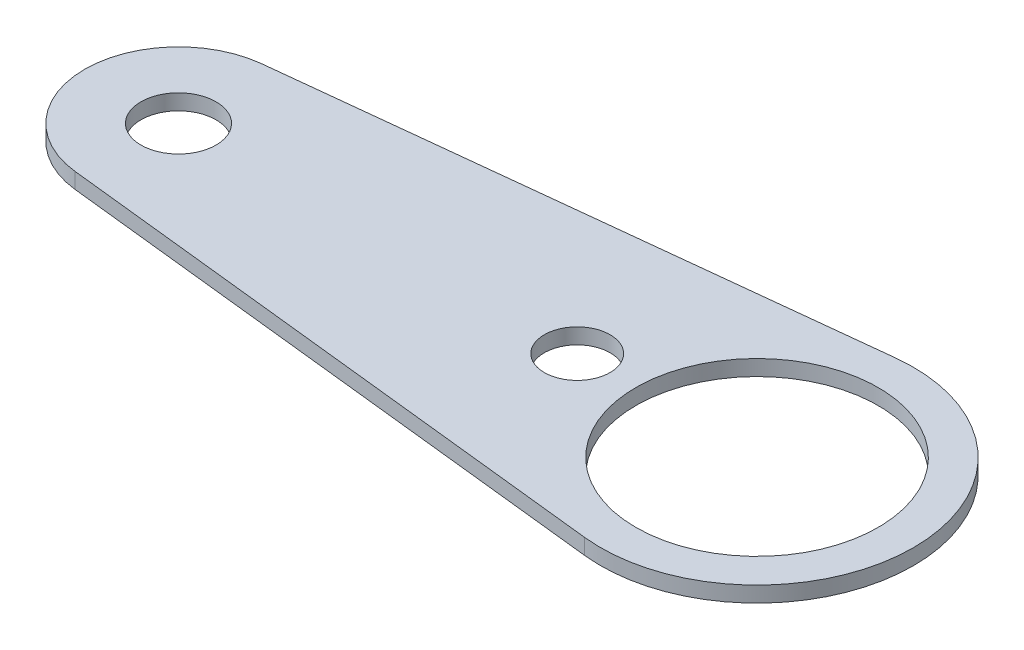
ISO-10303-21;
HEADER;
FILE_DESCRIPTION(('STEP AP214'),'2;1');
FILE_NAME('part.step','',(''),(''),'','','');
FILE_SCHEMA(('AUTOMOTIVE_DESIGN { 1 0 10303 214 1 1 1 1 }'));
ENDSEC;
DATA;
#1=APPLICATION_CONTEXT('core data for automotive mechanical design processes');
#2=APPLICATION_PROTOCOL_DEFINITION('international standard','automotive_design',2000,#1);
#3=PRODUCT_CONTEXT('',#1,'mechanical');
#4=PRODUCT('Part','Part','',(#3));
#5=PRODUCT_RELATED_PRODUCT_CATEGORY('part','',(#4));
#6=PRODUCT_DEFINITION_FORMATION('','',#4);
#7=PRODUCT_DEFINITION_CONTEXT('part definition',#1,'design');
#8=PRODUCT_DEFINITION('design','',#6,#7);
#9=PRODUCT_DEFINITION_SHAPE('','',#8);
#10=(LENGTH_UNIT() NAMED_UNIT(*) SI_UNIT(.MILLI.,.METRE.));
#11=(NAMED_UNIT(*) PLANE_ANGLE_UNIT() SI_UNIT($,.RADIAN.));
#12=(NAMED_UNIT(*) SI_UNIT($,.STERADIAN.) SOLID_ANGLE_UNIT());
#13=UNCERTAINTY_MEASURE_WITH_UNIT(LENGTH_MEASURE(1.E-05),#10,'distance_accuracy_value','');
#14=(GEOMETRIC_REPRESENTATION_CONTEXT(3) GLOBAL_UNCERTAINTY_ASSIGNED_CONTEXT((#13)) GLOBAL_UNIT_ASSIGNED_CONTEXT((#10,
#11,#12)) REPRESENTATION_CONTEXT('',''));
#15=CARTESIAN_POINT('',(0.,0.,0.));
#16=DIRECTION('',(0.,0.,1.));
#17=DIRECTION('',(1.,0.,0.));
#18=AXIS2_PLACEMENT_3D('',#15,#16,#17);
#19=CARTESIAN_POINT('',(0.,1.,0.));
#20=DIRECTION('',(0.,1.,0.));
#21=DIRECTION('',(0.,0.,1.));
#22=AXIS2_PLACEMENT_3D('',#19,#20,#21);
#23=PLANE('',#22);
#24=CARTESIAN_POINT('',(0.,1.,0.));
#25=DIRECTION('',(0.,1.,0.));
#26=DIRECTION('',(0.,0.,1.));
#27=AXIS2_PLACEMENT_3D('',#24,#25,#26);
#28=CIRCLE('',#27,7.75);
#29=CARTESIAN_POINT('',(0.,1.,7.75));
#30=VERTEX_POINT('',#29);
#31=EDGE_CURVE('E115',#30,#30,#28,.T.);
#32=ORIENTED_EDGE('',*,*,#31,.F.);
#33=EDGE_LOOP('',(#32));
#34=FACE_BOUND('',#33,.T.);
#35=CARTESIAN_POINT('',(0.,1.,0.));
#36=DIRECTION('',(0.,1.,0.));
#37=DIRECTION('',(0.,0.,1.));
#38=AXIS2_PLACEMENT_3D('',#35,#36,#37);
#39=CIRCLE('',#38,10.);
#40=CARTESIAN_POINT('',(-1.08108108108108,1.,9.94139143662136));
#41=VERTEX_POINT('',#40);
#42=CARTESIAN_POINT('',(-1.08108108108108,1.,-9.94139143662136));
#43=VERTEX_POINT('',#42);
#44=EDGE_CURVE('E85',#41,#43,#39,.T.);
#45=ORIENTED_EDGE('',*,*,#44,.T.);
#46=DIRECTION('',(-0.994139143662136,0.,0.108108108108108));
#47=VECTOR('',#46,1.);
#48=CARTESIAN_POINT('',(-1.08108108108108,1.,-9.94139143662136));
#49=LINE('',#48,#47);
#50=CARTESIAN_POINT('',(-37.6486486486486,1.,-5.96483486197282));
#51=VERTEX_POINT('',#50);
#52=EDGE_CURVE('E80',#43,#51,#49,.T.);
#53=ORIENTED_EDGE('',*,*,#52,.T.);
#54=CARTESIAN_POINT('',(-37.,1.,0.));
#55=DIRECTION('',(0.,1.,0.));
#56=DIRECTION('',(0.,0.,1.));
#57=AXIS2_PLACEMENT_3D('',#54,#55,#56);
#58=CIRCLE('',#57,6.);
#59=CARTESIAN_POINT('',(-37.6486486486486,1.,5.96483486197282));
#60=VERTEX_POINT('',#59);
#61=EDGE_CURVE('E83',#51,#60,#58,.T.);
#62=ORIENTED_EDGE('',*,*,#61,.T.);
#63=DIRECTION('',(0.994139143662136,0.,0.108108108108108));
#64=VECTOR('',#63,1.);
#65=CARTESIAN_POINT('',(-1.08108108108108,1.,9.94139143662136));
#66=LINE('',#65,#64);
#67=EDGE_CURVE('E50',#60,#41,#66,.T.);
#68=ORIENTED_EDGE('',*,*,#67,.T.);
#69=EDGE_LOOP('',(#45,#53,#62,#68));
#70=FACE_BOUND('',#69,.T.);
#71=CARTESIAN_POINT('',(-37.,1.,0.));
#72=DIRECTION('',(0.,1.,0.));
#73=DIRECTION('',(0.,0.,1.));
#74=AXIS2_PLACEMENT_3D('',#71,#72,#73);
#75=CIRCLE('',#74,2.4);
#76=CARTESIAN_POINT('',(-37.,1.,2.4));
#77=VERTEX_POINT('',#76);
#78=EDGE_CURVE('E100',#77,#77,#75,.T.);
#79=ORIENTED_EDGE('',*,*,#78,.F.);
#80=EDGE_LOOP('',(#79));
#81=FACE_BOUND('',#80,.T.);
#82=CARTESIAN_POINT('',(-11.5,1.,0.));
#83=DIRECTION('',(0.,1.,0.));
#84=DIRECTION('',(0.,0.,1.));
#85=AXIS2_PLACEMENT_3D('',#82,#83,#84);
#86=CIRCLE('',#85,2.1);
#87=CARTESIAN_POINT('',(-11.5,1.,2.1));
#88=VERTEX_POINT('',#87);
#89=EDGE_CURVE('E121',#88,#88,#86,.T.);
#90=ORIENTED_EDGE('',*,*,#89,.F.);
#91=EDGE_LOOP('',(#90));
#92=FACE_BOUND('',#91,.T.);
#93=ADVANCED_FACE('F33',(#34,#70,#81,#92),#23,.T.);
#94=CARTESIAN_POINT('',(0.,0.,0.));
#95=DIRECTION('',(0.,1.,0.));
#96=DIRECTION('',(0.,0.,1.));
#97=AXIS2_PLACEMENT_3D('',#94,#95,#96);
#98=PLANE('',#97);
#99=CARTESIAN_POINT('',(0.,0.,0.));
#100=DIRECTION('',(0.,1.,0.));
#101=DIRECTION('',(0.,0.,1.));
#102=AXIS2_PLACEMENT_3D('',#99,#100,#101);
#103=CIRCLE('',#102,10.);
#104=CARTESIAN_POINT('',(-1.08108108108108,0.,9.94139143662136));
#105=VERTEX_POINT('',#104);
#106=CARTESIAN_POINT('',(-1.08108108108108,0.,-9.94139143662136));
#107=VERTEX_POINT('',#106);
#108=EDGE_CURVE('E97',#105,#107,#103,.T.);
#109=ORIENTED_EDGE('',*,*,#108,.F.);
#110=DIRECTION('',(0.994139143662136,0.,0.108108108108108));
#111=VECTOR('',#110,1.);
#112=CARTESIAN_POINT('',(-1.08108108108108,0.,9.94139143662136));
#113=LINE('',#112,#111);
#114=CARTESIAN_POINT('',(-37.6486486486486,0.,5.96483486197282));
#115=VERTEX_POINT('',#114);
#116=EDGE_CURVE('E73',#115,#105,#113,.T.);
#117=ORIENTED_EDGE('',*,*,#116,.F.);
#118=CARTESIAN_POINT('',(-37.,0.,0.));
#119=DIRECTION('',(0.,1.,0.));
#120=DIRECTION('',(0.,0.,1.));
#121=AXIS2_PLACEMENT_3D('',#118,#119,#120);
#122=CIRCLE('',#121,6.);
#123=CARTESIAN_POINT('',(-37.6486486486486,0.,-5.96483486197282));
#124=VERTEX_POINT('',#123);
#125=EDGE_CURVE('E67',#124,#115,#122,.T.);
#126=ORIENTED_EDGE('',*,*,#125,.F.);
#127=DIRECTION('',(-0.994139143662136,0.,0.108108108108108));
#128=VECTOR('',#127,1.);
#129=CARTESIAN_POINT('',(-1.08108108108108,0.,-9.94139143662136));
#130=LINE('',#129,#128);
#131=EDGE_CURVE('E89',#107,#124,#130,.T.);
#132=ORIENTED_EDGE('',*,*,#131,.F.);
#133=EDGE_LOOP('',(#109,#117,#126,#132));
#134=FACE_BOUND('',#133,.T.);
#135=CARTESIAN_POINT('',(-37.,0.,0.));
#136=DIRECTION('',(0.,1.,0.));
#137=DIRECTION('',(0.,0.,1.));
#138=AXIS2_PLACEMENT_3D('',#135,#136,#137);
#139=CIRCLE('',#138,2.4);
#140=CARTESIAN_POINT('',(-37.,0.,2.4));
#141=VERTEX_POINT('',#140);
#142=EDGE_CURVE('E112',#141,#141,#139,.T.);
#143=ORIENTED_EDGE('',*,*,#142,.T.);
#144=EDGE_LOOP('',(#143));
#145=FACE_BOUND('',#144,.T.);
#146=CARTESIAN_POINT('',(0.,0.,0.));
#147=DIRECTION('',(0.,1.,0.));
#148=DIRECTION('',(0.,0.,1.));
#149=AXIS2_PLACEMENT_3D('',#146,#147,#148);
#150=CIRCLE('',#149,7.75);
#151=CARTESIAN_POINT('',(0.,0.,7.75));
#152=VERTEX_POINT('',#151);
#153=EDGE_CURVE('E118',#152,#152,#150,.T.);
#154=ORIENTED_EDGE('',*,*,#153,.T.);
#155=EDGE_LOOP('',(#154));
#156=FACE_BOUND('',#155,.T.);
#157=CARTESIAN_POINT('',(-11.5,0.,0.));
#158=DIRECTION('',(0.,1.,0.));
#159=DIRECTION('',(0.,0.,1.));
#160=AXIS2_PLACEMENT_3D('',#157,#158,#159);
#161=CIRCLE('',#160,2.1);
#162=CARTESIAN_POINT('',(-11.5,0.,2.1));
#163=VERTEX_POINT('',#162);
#164=EDGE_CURVE('E124',#163,#163,#161,.T.);
#165=ORIENTED_EDGE('',*,*,#164,.T.);
#166=EDGE_LOOP('',(#165));
#167=FACE_BOUND('',#166,.T.);
#168=ADVANCED_FACE('F108',(#134,#145,#156,#167),#98,.F.);
#169=CARTESIAN_POINT('',(0.,1.,0.));
#170=DIRECTION('',(0.,-1.,0.));
#171=DIRECTION('',(0.,0.,-1.));
#172=AXIS2_PLACEMENT_3D('',#169,#170,#171);
#173=CYLINDRICAL_SURFACE('',#172,10.);
#174=ORIENTED_EDGE('',*,*,#108,.T.);
#175=DIRECTION('',(0.,-1.,0.));
#176=VECTOR('',#175,1.);
#177=CARTESIAN_POINT('',(-1.08108108108108,1.,-9.94139143662136));
#178=LINE('',#177,#176);
#179=EDGE_CURVE('E11',#43,#107,#178,.T.);
#180=ORIENTED_EDGE('',*,*,#179,.F.);
#181=ORIENTED_EDGE('',*,*,#44,.F.);
#182=DIRECTION('',(0.,-1.,0.));
#183=VECTOR('',#182,1.);
#184=CARTESIAN_POINT('',(-1.08108108108108,1.,9.94139143662136));
#185=LINE('',#184,#183);
#186=EDGE_CURVE('E93',#41,#105,#185,.T.);
#187=ORIENTED_EDGE('',*,*,#186,.T.);
#188=EDGE_LOOP('',(#174,#180,#181,#187));
#189=FACE_BOUND('',#188,.T.);
#190=ADVANCED_FACE('F35',(#189),#173,.T.);
#191=CARTESIAN_POINT('',(-1.08108108108108,1.,-9.94139143662136));
#192=DIRECTION('',(0.108108108108108,0.,0.994139143662136));
#193=DIRECTION('',(0.994139143662136,0.,-0.108108108108108));
#194=AXIS2_PLACEMENT_3D('',#191,#192,#193);
#195=PLANE('',#194);
#196=ORIENTED_EDGE('',*,*,#131,.T.);
#197=DIRECTION('',(0.,-1.,0.));
#198=VECTOR('',#197,1.);
#199=CARTESIAN_POINT('',(-37.6486486486486,1.,-5.96483486197282));
#200=LINE('',#199,#198);
#201=EDGE_CURVE('E42',#51,#124,#200,.T.);
#202=ORIENTED_EDGE('',*,*,#201,.F.);
#203=ORIENTED_EDGE('',*,*,#52,.F.);
#204=ORIENTED_EDGE('',*,*,#179,.T.);
#205=EDGE_LOOP('',(#196,#202,#203,#204));
#206=FACE_BOUND('',#205,.T.);
#207=ADVANCED_FACE('F88',(#206),#195,.F.);
#208=CARTESIAN_POINT('',(-37.,1.,0.));
#209=DIRECTION('',(0.,-1.,0.));
#210=DIRECTION('',(0.,0.,-1.));
#211=AXIS2_PLACEMENT_3D('',#208,#209,#210);
#212=CYLINDRICAL_SURFACE('',#211,6.);
#213=ORIENTED_EDGE('',*,*,#125,.T.);
#214=DIRECTION('',(0.,-1.,0.));
#215=VECTOR('',#214,1.);
#216=CARTESIAN_POINT('',(-37.6486486486486,1.,5.96483486197282));
#217=LINE('',#216,#215);
#218=EDGE_CURVE('E90',#60,#115,#217,.T.);
#219=ORIENTED_EDGE('',*,*,#218,.F.);
#220=ORIENTED_EDGE('',*,*,#61,.F.);
#221=ORIENTED_EDGE('',*,*,#201,.T.);
#222=EDGE_LOOP('',(#213,#219,#220,#221));
#223=FACE_BOUND('',#222,.T.);
#224=ADVANCED_FACE('F91',(#223),#212,.T.);
#225=CARTESIAN_POINT('',(-1.08108108108108,1.,9.94139143662136));
#226=DIRECTION('',(0.108108108108108,0.,-0.994139143662136));
#227=DIRECTION('',(-0.994139143662136,0.,-0.108108108108108));
#228=AXIS2_PLACEMENT_3D('',#225,#226,#227);
#229=PLANE('',#228);
#230=ORIENTED_EDGE('',*,*,#116,.T.);
#231=ORIENTED_EDGE('',*,*,#186,.F.);
#232=ORIENTED_EDGE('',*,*,#67,.F.);
#233=ORIENTED_EDGE('',*,*,#218,.T.);
#234=EDGE_LOOP('',(#230,#231,#232,#233));
#235=FACE_BOUND('',#234,.T.);
#236=ADVANCED_FACE('F105',(#235),#229,.F.);
#237=CARTESIAN_POINT('',(-37.,1.,0.));
#238=DIRECTION('',(0.,-1.,0.));
#239=DIRECTION('',(0.,0.,-1.));
#240=AXIS2_PLACEMENT_3D('',#237,#238,#239);
#241=CYLINDRICAL_SURFACE('',#240,2.4);
#242=ORIENTED_EDGE('',*,*,#78,.T.);
#243=EDGE_LOOP('',(#242));
#244=FACE_BOUND('',#243,.T.);
#245=ORIENTED_EDGE('',*,*,#142,.F.);
#246=EDGE_LOOP('',(#245));
#247=FACE_BOUND('',#246,.T.);
#248=ADVANCED_FACE('F142',(#244,#247),#241,.F.);
#249=CARTESIAN_POINT('',(0.,1.,0.));
#250=DIRECTION('',(0.,-1.,0.));
#251=DIRECTION('',(0.,0.,-1.));
#252=AXIS2_PLACEMENT_3D('',#249,#250,#251);
#253=CYLINDRICAL_SURFACE('',#252,7.75);
#254=ORIENTED_EDGE('',*,*,#31,.T.);
#255=EDGE_LOOP('',(#254));
#256=FACE_BOUND('',#255,.T.);
#257=ORIENTED_EDGE('',*,*,#153,.F.);
#258=EDGE_LOOP('',(#257));
#259=FACE_BOUND('',#258,.T.);
#260=ADVANCED_FACE('F188',(#256,#259),#253,.F.);
#261=CARTESIAN_POINT('',(-11.5,1.,0.));
#262=DIRECTION('',(0.,-1.,0.));
#263=DIRECTION('',(0.,0.,-1.));
#264=AXIS2_PLACEMENT_3D('',#261,#262,#263);
#265=CYLINDRICAL_SURFACE('',#264,2.1);
#266=ORIENTED_EDGE('',*,*,#89,.T.);
#267=EDGE_LOOP('',(#266));
#268=FACE_BOUND('',#267,.T.);
#269=ORIENTED_EDGE('',*,*,#164,.F.);
#270=EDGE_LOOP('',(#269));
#271=FACE_BOUND('',#270,.T.);
#272=ADVANCED_FACE('F130',(#268,#271),#265,.F.);
#273=CLOSED_SHELL('',(#93,#168,#190,#207,#224,#236,#248,#260,#272));
#274=MANIFOLD_SOLID_BREP('B2',#273);
#275=ADVANCED_BREP_SHAPE_REPRESENTATION('',(#18,#274),#14);
#276=SHAPE_DEFINITION_REPRESENTATION(#9,#275);
ENDSEC;
END-ISO-10303-21;
